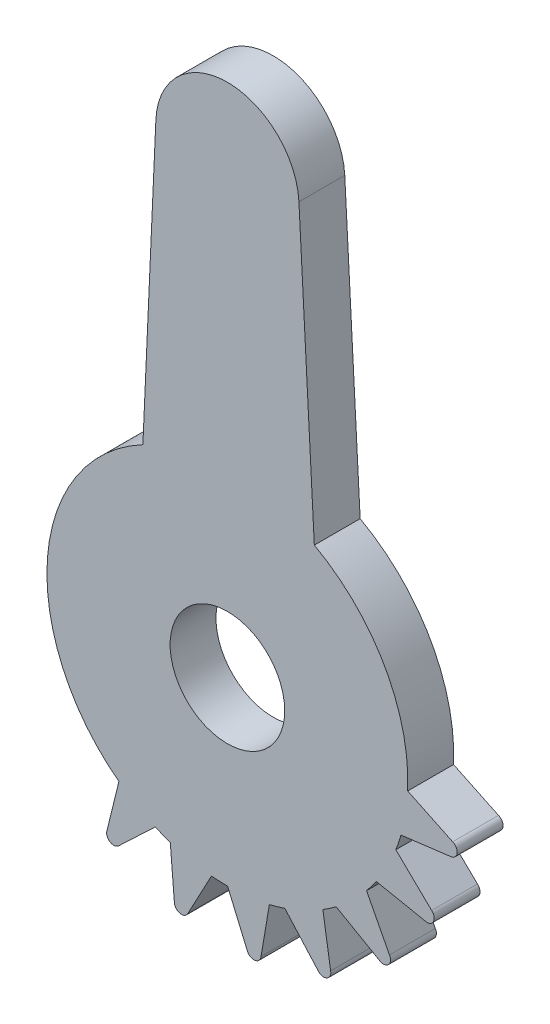
ISO-10303-21;
HEADER;
FILE_DESCRIPTION(('STEP AP214'),'2;1');
FILE_NAME('part.step','',(''),(''),'','','');
FILE_SCHEMA(('AUTOMOTIVE_DESIGN { 1 0 10303 214 1 1 1 1 }'));
ENDSEC;
DATA;
#1=APPLICATION_CONTEXT('core data for automotive mechanical design processes');
#2=APPLICATION_PROTOCOL_DEFINITION('international standard','automotive_design',2000,#1);
#3=PRODUCT_CONTEXT('',#1,'mechanical');
#4=PRODUCT('Part','Part','',(#3));
#5=PRODUCT_RELATED_PRODUCT_CATEGORY('part','',(#4));
#6=PRODUCT_DEFINITION_FORMATION('','',#4);
#7=PRODUCT_DEFINITION_CONTEXT('part definition',#1,'design');
#8=PRODUCT_DEFINITION('design','',#6,#7);
#9=PRODUCT_DEFINITION_SHAPE('','',#8);
#10=(LENGTH_UNIT() NAMED_UNIT(*) SI_UNIT(.MILLI.,.METRE.));
#11=(NAMED_UNIT(*) PLANE_ANGLE_UNIT() SI_UNIT($,.RADIAN.));
#12=(NAMED_UNIT(*) SI_UNIT($,.STERADIAN.) SOLID_ANGLE_UNIT());
#13=UNCERTAINTY_MEASURE_WITH_UNIT(LENGTH_MEASURE(1.E-05),#10,'distance_accuracy_value','');
#14=(GEOMETRIC_REPRESENTATION_CONTEXT(3) GLOBAL_UNCERTAINTY_ASSIGNED_CONTEXT((#13)) GLOBAL_UNIT_ASSIGNED_CONTEXT((#10,
#11,#12)) REPRESENTATION_CONTEXT('',''));
#15=CARTESIAN_POINT('',(0.,0.,0.));
#16=DIRECTION('',(0.,0.,1.));
#17=DIRECTION('',(1.,0.,0.));
#18=AXIS2_PLACEMENT_3D('',#15,#16,#17);
#19=CARTESIAN_POINT('',(15.,22.2824513013562,3.2));
#20=DIRECTION('',(0.,0.,-1.));
#21=DIRECTION('',(-1.,0.,0.));
#22=AXIS2_PLACEMENT_3D('',#19,#20,#21);
#23=CYLINDRICAL_SURFACE('',#22,12.6);
#24=CARTESIAN_POINT('',(15.,22.2824513013562,3.2));
#25=DIRECTION('',(0.,0.,1.));
#26=DIRECTION('',(1.,0.,0.));
#27=AXIS2_PLACEMENT_3D('',#24,#25,#26);
#28=CIRCLE('',#27,12.6);
#29=CARTESIAN_POINT('',(26.7583335934315,17.7545830274794,3.2));
#30=VERTEX_POINT('',#29);
#31=CARTESIAN_POINT('',(27.1145785737894,18.818784749928,3.2));
#32=VERTEX_POINT('',#31);
#33=EDGE_CURVE('E426',#30,#32,#28,.T.);
#34=ORIENTED_EDGE('',*,*,#33,.F.);
#35=DIRECTION('',(0.,0.,1.));
#36=VECTOR('',#35,1.);
#37=CARTESIAN_POINT('',(26.7583335934315,17.7545830274794,0.));
#38=LINE('',#37,#36);
#39=CARTESIAN_POINT('',(26.7583335934315,17.7545830274794,0.));
#40=VERTEX_POINT('',#39);
#41=EDGE_CURVE('E388',#40,#30,#38,.T.);
#42=ORIENTED_EDGE('',*,*,#41,.F.);
#43=CARTESIAN_POINT('',(15.,22.2824513013562,0.));
#44=DIRECTION('',(0.,0.,1.));
#45=DIRECTION('',(1.,0.,0.));
#46=AXIS2_PLACEMENT_3D('',#43,#44,#45);
#47=CIRCLE('',#46,12.6);
#48=CARTESIAN_POINT('',(27.1145785737894,18.818784749928,0.));
#49=VERTEX_POINT('',#48);
#50=EDGE_CURVE('E288',#40,#49,#47,.T.);
#51=ORIENTED_EDGE('',*,*,#50,.T.);
#52=DIRECTION('',(0.,0.,1.));
#53=VECTOR('',#52,1.);
#54=CARTESIAN_POINT('',(27.1145785737894,18.818784749928,0.));
#55=LINE('',#54,#53);
#56=EDGE_CURVE('E382',#49,#32,#55,.T.);
#57=ORIENTED_EDGE('',*,*,#56,.T.);
#58=EDGE_LOOP('',(#34,#42,#51,#57));
#59=FACE_BOUND('',#58,.T.);
#60=ADVANCED_FACE('F45',(#59),#23,.T.);
#61=CARTESIAN_POINT('',(24.7139922055668,14.2575927088209,0.));
#62=VERTEX_POINT('',#61);
#63=CARTESIAN_POINT('',(25.3895039093759,15.1537621850416,0.));
#64=VERTEX_POINT('',#63);
#65=EDGE_CURVE('E277',#62,#64,#47,.T.);
#66=ORIENTED_EDGE('',*,*,#65,.T.);
#67=DIRECTION('',(0.,0.,1.));
#68=VECTOR('',#67,1.);
#69=CARTESIAN_POINT('',(25.3895039093759,15.1537621850416,0.));
#70=LINE('',#69,#68);
#71=CARTESIAN_POINT('',(25.3895039093759,15.1537621850416,3.2));
#72=VERTEX_POINT('',#71);
#73=EDGE_CURVE('E257',#64,#72,#70,.T.);
#74=ORIENTED_EDGE('',*,*,#73,.T.);
#75=CARTESIAN_POINT('',(24.7139922055668,14.2575927088209,3.2));
#76=VERTEX_POINT('',#75);
#77=EDGE_CURVE('E588',#76,#72,#28,.T.);
#78=ORIENTED_EDGE('',*,*,#77,.F.);
#79=DIRECTION('',(0.,0.,1.));
#80=VECTOR('',#79,1.);
#81=CARTESIAN_POINT('',(24.7139922055668,14.2575927088209,0.));
#82=LINE('',#81,#80);
#83=EDGE_CURVE('E285',#62,#76,#82,.T.);
#84=ORIENTED_EDGE('',*,*,#83,.F.);
#85=EDGE_LOOP('',(#66,#74,#78,#84));
#86=FACE_BOUND('',#85,.T.);
#87=ADVANCED_FACE('F284',(#86),#23,.T.);
#88=CARTESIAN_POINT('',(21.6656835966238,11.5899931092611,0.));
#89=VERTEX_POINT('',#88);
#90=CARTESIAN_POINT('',(22.5906460724476,12.2255088135602,0.));
#91=VERTEX_POINT('',#90);
#92=EDGE_CURVE('E287',#89,#91,#47,.T.);
#93=ORIENTED_EDGE('',*,*,#92,.T.);
#94=DIRECTION('',(0.,0.,1.));
#95=VECTOR('',#94,1.);
#96=CARTESIAN_POINT('',(22.5906460724476,12.2255088135602,0.));
#97=LINE('',#96,#95);
#98=CARTESIAN_POINT('',(22.5906460724476,12.2255088135602,3.2));
#99=VERTEX_POINT('',#98);
#100=EDGE_CURVE('E484',#91,#99,#97,.T.);
#101=ORIENTED_EDGE('',*,*,#100,.T.);
#102=CARTESIAN_POINT('',(21.6656835966238,11.5899931092611,3.2));
#103=VERTEX_POINT('',#102);
#104=EDGE_CURVE('E592',#103,#99,#28,.T.);
#105=ORIENTED_EDGE('',*,*,#104,.F.);
#106=DIRECTION('',(0.,0.,1.));
#107=VECTOR('',#106,1.);
#108=CARTESIAN_POINT('',(21.6656835966238,11.5899931092611,0.));
#109=LINE('',#108,#107);
#110=EDGE_CURVE('E496',#89,#103,#109,.T.);
#111=ORIENTED_EDGE('',*,*,#110,.F.);
#112=EDGE_LOOP('',(#93,#101,#105,#111));
#113=FACE_BOUND('',#112,.T.);
#114=ADVANCED_FACE('F633',(#113),#23,.T.);
#115=CARTESIAN_POINT('',(17.9284586600298,10.0274878221574,0.));
#116=VERTEX_POINT('',#115);
#117=CARTESIAN_POINT('',(19.0072745482241,10.3366674972203,0.));
#118=VERTEX_POINT('',#117);
#119=EDGE_CURVE('E293',#116,#118,#47,.T.);
#120=ORIENTED_EDGE('',*,*,#119,.T.);
#121=DIRECTION('',(0.,0.,1.));
#122=VECTOR('',#121,1.);
#123=CARTESIAN_POINT('',(19.0072745482241,10.3366674972203,0.));
#124=LINE('',#123,#122);
#125=CARTESIAN_POINT('',(19.0072745482241,10.3366674972203,3.2));
#126=VERTEX_POINT('',#125);
#127=EDGE_CURVE('E459',#118,#126,#124,.T.);
#128=ORIENTED_EDGE('',*,*,#127,.T.);
#129=CARTESIAN_POINT('',(17.9284586600298,10.0274878221574,3.2));
#130=VERTEX_POINT('',#129);
#131=EDGE_CURVE('E584',#130,#126,#28,.T.);
#132=ORIENTED_EDGE('',*,*,#131,.F.);
#133=DIRECTION('',(0.,0.,1.));
#134=VECTOR('',#133,1.);
#135=CARTESIAN_POINT('',(17.9284586600298,10.0274878221574,0.));
#136=LINE('',#135,#134);
#137=EDGE_CURVE('E462',#116,#130,#136,.T.);
#138=ORIENTED_EDGE('',*,*,#137,.F.);
#139=EDGE_LOOP('',(#120,#128,#132,#138));
#140=FACE_BOUND('',#139,.T.);
#141=ADVANCED_FACE('F457',(#140),#23,.T.);
#142=CARTESIAN_POINT('',(13.8885696445755,9.73156597142661,0.));
#143=VERTEX_POINT('',#142);
#144=CARTESIAN_POINT('',(15.0097404215258,9.68245506626988,0.));
#145=VERTEX_POINT('',#144);
#146=EDGE_CURVE('E440',#143,#145,#47,.T.);
#147=ORIENTED_EDGE('',*,*,#146,.T.);
#148=DIRECTION('',(0.,0.,1.));
#149=VECTOR('',#148,1.);
#150=CARTESIAN_POINT('',(15.0097404215258,9.68245506626988,0.));
#151=LINE('',#150,#149);
#152=CARTESIAN_POINT('',(15.0097404215258,9.68245506626988,3.2));
#153=VERTEX_POINT('',#152);
#154=EDGE_CURVE('E520',#145,#153,#151,.T.);
#155=ORIENTED_EDGE('',*,*,#154,.T.);
#156=CARTESIAN_POINT('',(13.8885696445755,9.73156597142661,3.2));
#157=VERTEX_POINT('',#156);
#158=EDGE_CURVE('E581',#157,#153,#28,.T.);
#159=ORIENTED_EDGE('',*,*,#158,.F.);
#160=DIRECTION('',(0.,0.,1.));
#161=VECTOR('',#160,1.);
#162=CARTESIAN_POINT('',(13.8885696445755,9.73156597142661,0.));
#163=LINE('',#162,#161);
#164=EDGE_CURVE('E526',#143,#157,#163,.T.);
#165=ORIENTED_EDGE('',*,*,#164,.F.);
#166=EDGE_LOOP('',(#147,#155,#159,#165));
#167=FACE_BOUND('',#166,.T.);
#168=ADVANCED_FACE('F608',(#167),#23,.T.);
#169=CARTESIAN_POINT('',(9.96354994564374,10.7328118762497,0.));
#170=VERTEX_POINT('',#169);
#171=CARTESIAN_POINT('',(11.0111995960651,10.3304861350093,0.));
#172=VERTEX_POINT('',#171);
#173=EDGE_CURVE('E301',#170,#172,#47,.T.);
#174=ORIENTED_EDGE('',*,*,#173,.T.);
#175=DIRECTION('',(0.,0.,1.));
#176=VECTOR('',#175,1.);
#177=CARTESIAN_POINT('',(11.0111995960651,10.3304861350093,0.));
#178=LINE('',#177,#176);
#179=CARTESIAN_POINT('',(11.0111995960651,10.3304861350093,3.2));
#180=VERTEX_POINT('',#179);
#181=EDGE_CURVE('E344',#172,#180,#178,.T.);
#182=ORIENTED_EDGE('',*,*,#181,.T.);
#183=CARTESIAN_POINT('',(9.96354994564374,10.7328118762497,3.2));
#184=VERTEX_POINT('',#183);
#185=EDGE_CURVE('E425',#184,#180,#28,.T.);
#186=ORIENTED_EDGE('',*,*,#185,.F.);
#187=DIRECTION('',(0.,0.,1.));
#188=VECTOR('',#187,1.);
#189=CARTESIAN_POINT('',(9.96354994564374,10.7328118762497,0.));
#190=LINE('',#189,#188);
#191=EDGE_CURVE('E357',#170,#184,#190,.T.);
#192=ORIENTED_EDGE('',*,*,#191,.F.);
#193=EDGE_LOOP('',(#174,#182,#186,#192));
#194=FACE_BOUND('',#193,.T.);
#195=ADVANCED_FACE('F575',(#194),#23,.T.);
#196=CARTESIAN_POINT('',(27.5874195793468,21.7195407103414,3.2));
#197=VERTEX_POINT('',#196);
#198=CARTESIAN_POINT('',(21.0679006405689,33.3251222561652,3.2));
#199=VERTEX_POINT('',#198);
#200=EDGE_CURVE('E422',#197,#199,#28,.T.);
#201=ORIENTED_EDGE('',*,*,#200,.F.);
#202=DIRECTION('',(0.,0.,1.));
#203=VECTOR('',#202,1.);
#204=CARTESIAN_POINT('',(27.5874195793468,21.7195407103414,0.));
#205=LINE('',#204,#203);
#206=CARTESIAN_POINT('',(27.5874195793468,21.7195407103414,0.));
#207=VERTEX_POINT('',#206);
#208=EDGE_CURVE('E394',#207,#197,#205,.T.);
#209=ORIENTED_EDGE('',*,*,#208,.F.);
#210=CARTESIAN_POINT('',(21.0679006405689,33.3251222561652,0.));
#211=VERTEX_POINT('',#210);
#212=EDGE_CURVE('E294',#207,#211,#47,.T.);
#213=ORIENTED_EDGE('',*,*,#212,.T.);
#214=DIRECTION('',(0.,0.,-1.));
#215=VECTOR('',#214,1.);
#216=CARTESIAN_POINT('',(21.0679006405689,33.3251222561652,3.2));
#217=LINE('',#216,#215);
#218=EDGE_CURVE('E311',#199,#211,#217,.T.);
#219=ORIENTED_EDGE('',*,*,#218,.F.);
#220=EDGE_LOOP('',(#201,#209,#213,#219));
#221=FACE_BOUND('',#220,.T.);
#222=ADVANCED_FACE('F638',(#221),#23,.T.);
#223=CARTESIAN_POINT('',(15.0000678717785,53.2824513013562,3.2));
#224=DIRECTION('',(0.,0.,1.));
#225=DIRECTION('',(1.,0.,0.));
#226=AXIS2_PLACEMENT_3D('',#223,#224,#225);
#227=PLANE('',#226);
#228=CARTESIAN_POINT('',(15.0000678717785,53.2824513013562,3.2));
#229=DIRECTION('',(0.,0.,1.));
#230=DIRECTION('',(1.,0.,0.));
#231=AXIS2_PLACEMENT_3D('',#228,#229,#230);
#232=CIRCLE('',#231,5.);
#233=CARTESIAN_POINT('',(19.9930199252551,53.547837419463,3.2));
#234=VERTEX_POINT('',#233);
#235=CARTESIAN_POINT('',(10.0021530792262,53.4268387190461,3.2));
#236=VERTEX_POINT('',#235);
#237=EDGE_CURVE('E306',#234,#236,#232,.T.);
#238=ORIENTED_EDGE('',*,*,#237,.T.);
#239=DIRECTION('',(-0.0451163157054483,-0.998981740602483,0.));
#240=VECTOR('',#239,1.);
#241=CARTESIAN_POINT('',(9.09836644123298,33.4148688886566,3.2));
#242=LINE('',#241,#240);
#243=CARTESIAN_POINT('',(9.09836644123298,33.4148688886566,3.2));
#244=VERTEX_POINT('',#243);
#245=EDGE_CURVE('E419',#236,#244,#242,.T.);
#246=ORIENTED_EDGE('',*,*,#245,.T.);
#247=CARTESIAN_POINT('',(7.42491202057918,12.213784949548,3.2));
#248=VERTEX_POINT('',#247);
#249=EDGE_CURVE('E324',#244,#248,#28,.T.);
#250=ORIENTED_EDGE('',*,*,#249,.T.);
#251=DIRECTION('',(-0.238928061467362,-0.971037270882765,0.));
#252=VECTOR('',#251,1.);
#253=CARTESIAN_POINT('',(7.42491202057918,12.213784949548,3.2));
#254=LINE('',#253,#252);
#255=CARTESIAN_POINT('',(6.5987696482844,8.85622606915957,3.2));
#256=VERTEX_POINT('',#255);
#257=EDGE_CURVE('E350',#248,#256,#254,.T.);
#258=ORIENTED_EDGE('',*,*,#257,.T.);
#259=CARTESIAN_POINT('',(7.065559861533,8.67704209438692,3.2));
#260=DIRECTION('',(0.,0.,1.));
#261=DIRECTION('',(-0.358367949545304,-0.9335804264972,0.));
#262=AXIS2_PLACEMENT_3D('',#259,#260,#261);
#263=CIRCLE('',#262,0.5);
#264=CARTESIAN_POINT('',(7.43532642227367,8.34048200976901,3.2));
#265=VERTEX_POINT('',#264);
#266=EDGE_CURVE('E341',#256,#265,#263,.T.);
#267=ORIENTED_EDGE('',*,*,#266,.T.);
#268=DIRECTION('',(0.726358387399852,0.68731615218463,0.));
#269=VECTOR('',#268,1.);
#270=CARTESIAN_POINT('',(9.96354994564374,10.7328118762497,3.2));
#271=LINE('',#270,#269);
#272=EDGE_CURVE('E335',#265,#184,#271,.T.);
#273=ORIENTED_EDGE('',*,*,#272,.T.);
#274=ORIENTED_EDGE('',*,*,#185,.T.);
#275=DIRECTION('',(0.0815335150119343,-0.996670600514432,0.));
#276=VECTOR('',#275,1.);
#277=CARTESIAN_POINT('',(11.0111995960651,10.3304861350093,3.2));
#278=LINE('',#277,#276);
#279=CARTESIAN_POINT('',(11.2931183087513,6.88429480340664,3.2));
#280=VERTEX_POINT('',#279);
#281=EDGE_CURVE('E361',#180,#280,#278,.T.);
#282=ORIENTED_EDGE('',*,*,#281,.T.);
#283=CARTESIAN_POINT('',(11.7926424195423,6.86248510972397,3.2));
#284=DIRECTION('',(0.,0.,1.));
#285=DIRECTION('',(-0.0436193873653397,-0.999048221581858,0.));
#286=AXIS2_PLACEMENT_3D('',#283,#284,#285);
#287=CIRCLE('',#286,0.5);
#288=CARTESIAN_POINT('',(12.2500928780062,6.66064587158852,3.2));
#289=VERTEX_POINT('',#288);
#290=EDGE_CURVE('E557',#280,#289,#287,.T.);
#291=ORIENTED_EDGE('',*,*,#290,.T.);
#292=DIRECTION('',(0.470734225418094,0.882275064262856,0.));
#293=VECTOR('',#292,1.);
#294=CARTESIAN_POINT('',(13.8885696445755,9.73156597142661,3.2));
#295=LINE('',#294,#293);
#296=EDGE_CURVE('E547',#289,#157,#295,.T.);
#297=ORIENTED_EDGE('',*,*,#296,.T.);
#298=ORIENTED_EDGE('',*,*,#158,.T.);
#299=DIRECTION('',(0.393568383423217,-0.919295342950042,0.));
#300=VECTOR('',#299,1.);
#301=CARTESIAN_POINT('',(15.0097404215258,9.68245506626988,3.2));
#302=LINE('',#301,#300);
#303=CARTESIAN_POINT('',(16.3705831619918,6.50380442640759,3.2));
#304=VERTEX_POINT('',#303);
#305=EDGE_CURVE('E521',#153,#304,#302,.T.);
#306=ORIENTED_EDGE('',*,*,#305,.T.);
#307=CARTESIAN_POINT('',(16.851214009961,6.64162310431609,3.2));
#308=DIRECTION('',(0.,0.,1.));
#309=DIRECTION('',(0.275637355816996,-0.96126169593832,0.));
#310=AXIS2_PLACEMENT_3D('',#307,#308,#309);
#311=CIRCLE('',#310,0.5);
#312=CARTESIAN_POINT('',(17.3490696309129,6.59536534078871,3.2));
#313=VERTEX_POINT('',#312);
#314=EDGE_CURVE('E525',#304,#313,#311,.T.);
#315=ORIENTED_EDGE('',*,*,#314,.T.);
#316=DIRECTION('',(0.166458415158439,0.986048475493442,0.));
#317=VECTOR('',#316,1.);
#318=CARTESIAN_POINT('',(17.9284586600298,10.0274878221574,3.2));
#319=LINE('',#318,#317);
#320=EDGE_CURVE('E514',#313,#130,#319,.T.);
#321=ORIENTED_EDGE('',*,*,#320,.T.);
#322=ORIENTED_EDGE('',*,*,#131,.T.);
#323=DIRECTION('',(0.664926900871065,-0.746908439166409,0.));
#324=VECTOR('',#323,1.);
#325=CARTESIAN_POINT('',(19.0072745482241,10.3366674972203,3.2));
#326=LINE('',#325,#324);
#327=CARTESIAN_POINT('',(21.306394559137,7.75407964198749,3.2));
#328=VERTEX_POINT('',#327);
#329=EDGE_CURVE('E489',#126,#328,#326,.T.);
#330=ORIENTED_EDGE('',*,*,#329,.T.);
#331=CARTESIAN_POINT('',(21.718457653448,8.03728276044991,3.2));
#332=DIRECTION('',(0.,0.,1.));
#333=DIRECTION('',(0.566406236924831,-0.824126188622017,0.));
#334=AXIS2_PLACEMENT_3D('',#331,#332,#333);
#335=CIRCLE('',#334,0.5);
#336=CARTESIAN_POINT('',(22.2052637194363,8.15138733580546,3.2));
#337=VERTEX_POINT('',#336);
#338=EDGE_CURVE('E481',#328,#337,#335,.T.);
#339=ORIENTED_EDGE('',*,*,#338,.T.);
#340=DIRECTION('',(-0.155021320012331,0.987911124718026,0.));
#341=VECTOR('',#340,1.);
#342=CARTESIAN_POINT('',(21.6656835966238,11.5899931092611,3.2));
#343=LINE('',#342,#341);
#344=EDGE_CURVE('E475',#337,#103,#343,.T.);
#345=ORIENTED_EDGE('',*,*,#344,.T.);
#346=ORIENTED_EDGE('',*,*,#104,.T.);
#347=DIRECTION('',(0.86756343473474,-0.49732653931925,0.));
#348=VECTOR('',#347,1.);
#349=CARTESIAN_POINT('',(22.5906460724476,12.2255088135602,3.2));
#350=LINE('',#349,#348);
#351=CARTESIAN_POINT('',(25.5904231169948,10.5059011438914,3.2));
#352=VERTEX_POINT('',#351);
#353=EDGE_CURVE('E500',#99,#352,#350,.T.);
#354=ORIENTED_EDGE('',*,*,#353,.T.);
#355=CARTESIAN_POINT('',(25.8913306285708,10.9052188989151,3.2));
#356=DIRECTION('',(0.,0.,1.));
#357=DIRECTION('',(0.798635510047292,-0.601815023152049,0.));
#358=AXIS2_PLACEMENT_3D('',#355,#356,#357);
#359=CIRCLE('',#358,0.5);
#360=CARTESIAN_POINT('',(26.3167744233679,11.1678927983963,3.2));
#361=VERTEX_POINT('',#360);
#362=EDGE_CURVE('E862',#352,#361,#359,.T.);
#363=ORIENTED_EDGE('',*,*,#362,.T.);
#364=DIRECTION('',(-0.460479184816405,0.887670502129489,0.));
#365=VECTOR('',#364,1.);
#366=CARTESIAN_POINT('',(24.7139922055668,14.2575927088209,3.2));
#367=LINE('',#366,#365);
#368=EDGE_CURVE('E68',#361,#76,#367,.T.);
#369=ORIENTED_EDGE('',*,*,#368,.T.);
#370=ORIENTED_EDGE('',*,*,#77,.T.);
#371=DIRECTION('',(0.980534954230722,-0.196344604030152,0.));
#372=VECTOR('',#371,1.);
#373=CARTESIAN_POINT('',(25.3895039093759,15.1537621850416,3.2));
#374=LINE('',#373,#372);
#375=CARTESIAN_POINT('',(28.7799029618404,14.4748607786327,3.2));
#376=VERTEX_POINT('',#375);
#377=EDGE_CURVE('E262',#72,#376,#374,.T.);
#378=ORIENTED_EDGE('',*,*,#377,.T.);
#379=CARTESIAN_POINT('',(28.938555290043,14.9490226062358,3.2));
#380=DIRECTION('',(0.,0.,1.));
#381=DIRECTION('',(0.948323655206199,-0.317304656405093,0.));
#382=AXIS2_PLACEMENT_3D('',#379,#380,#381);
#383=CIRCLE('',#382,0.5);
#384=CARTESIAN_POINT('',(29.2586660531882,15.3331177758468,3.2));
#385=VERTEX_POINT('',#384);
#386=EDGE_CURVE('E829',#376,#385,#383,.T.);
#387=ORIENTED_EDGE('',*,*,#386,.T.);
#388=DIRECTION('',(-0.718345287370598,0.695686745678292,0.));
#389=VECTOR('',#388,1.);
#390=CARTESIAN_POINT('',(26.7583335934315,17.7545830274794,3.2));
#391=LINE('',#390,#389);
#392=EDGE_CURVE('E61',#385,#30,#391,.T.);
#393=ORIENTED_EDGE('',*,*,#392,.T.);
#394=ORIENTED_EDGE('',*,*,#33,.T.);
#395=DIRECTION('',(0.992165548972302,0.124930074171475,0.));
#396=VECTOR('',#395,1.);
#397=CARTESIAN_POINT('',(27.1145785737894,18.818784749928,3.2));
#398=LINE('',#397,#396);
#399=CARTESIAN_POINT('',(30.5451927733237,19.250755893096,3.2));
#400=VERTEX_POINT('',#399);
#401=EDGE_CURVE('E383',#32,#400,#398,.T.);
#402=ORIENTED_EDGE('',*,*,#401,.T.);
#403=CARTESIAN_POINT('',(30.5451927733237,19.750755893096,3.2));
#404=DIRECTION('',(0.,0.,1.));
#405=DIRECTION('',(1.,0.,0.));
#406=AXIS2_PLACEMENT_3D('',#403,#404,#405);
#407=CIRCLE('',#406,0.5);
#408=CARTESIAN_POINT('',(30.7268861964801,20.216575064,3.2));
#409=VERTEX_POINT('',#408);
#410=EDGE_CURVE('E387',#400,#409,#407,.T.);
#411=ORIENTED_EDGE('',*,*,#410,.T.);
#412=DIRECTION('',(-0.901968472422461,0.431801892950798,0.));
#413=VECTOR('',#412,1.);
#414=CARTESIAN_POINT('',(27.5874195793468,21.7195407103414,3.2));
#415=LINE('',#414,#413);
#416=EDGE_CURVE('E375',#409,#197,#415,.T.);
#417=ORIENTED_EDGE('',*,*,#416,.T.);
#418=ORIENTED_EDGE('',*,*,#200,.T.);
#419=DIRECTION('',(-0.0530772236213736,0.998590410695319,0.));
#420=VECTOR('',#419,1.);
#421=CARTESIAN_POINT('',(21.0679006405689,33.3251222561652,3.2));
#422=LINE('',#421,#420);
#423=EDGE_CURVE('E312',#199,#234,#422,.T.);
#424=ORIENTED_EDGE('',*,*,#423,.T.);
#425=EDGE_LOOP('',(#238,#246,#250,#258,#267,#273,#274,#282,#291,#297,#298,#306,#315,#321,#322,
#330,#339,#345,#346,#354,#363,#369,#370,#378,#387,#393,#394,#402,#411,#417,#418,#424));
#426=FACE_BOUND('',#425,.T.);
#427=CARTESIAN_POINT('',(15.,22.2824513013562,3.2));
#428=DIRECTION('',(0.,0.,1.));
#429=DIRECTION('',(1.,0.,0.));
#430=AXIS2_PLACEMENT_3D('',#427,#428,#429);
#431=CIRCLE('',#430,4.);
#432=CARTESIAN_POINT('',(19.,22.2824513013562,3.2));
#433=VERTEX_POINT('',#432);
#434=EDGE_CURVE('E408',#433,#433,#431,.T.);
#435=ORIENTED_EDGE('',*,*,#434,.F.);
#436=EDGE_LOOP('',(#435));
#437=FACE_BOUND('',#436,.T.);
#438=ADVANCED_FACE('F577',(#426,#437),#227,.T.);
#439=CARTESIAN_POINT('',(15.0000678717785,53.2824513013562,0.));
#440=DIRECTION('',(0.,0.,1.));
#441=DIRECTION('',(1.,0.,0.));
#442=AXIS2_PLACEMENT_3D('',#439,#440,#441);
#443=PLANE('',#442);
#444=CARTESIAN_POINT('',(15.0000678717785,53.2824513013562,0.));
#445=DIRECTION('',(0.,0.,1.));
#446=DIRECTION('',(1.,0.,0.));
#447=AXIS2_PLACEMENT_3D('',#444,#445,#446);
#448=CIRCLE('',#447,5.);
#449=CARTESIAN_POINT('',(19.9930199252551,53.547837419463,0.));
#450=VERTEX_POINT('',#449);
#451=CARTESIAN_POINT('',(10.0021530792262,53.4268387190461,0.));
#452=VERTEX_POINT('',#451);
#453=EDGE_CURVE('E412',#450,#452,#448,.T.);
#454=ORIENTED_EDGE('',*,*,#453,.F.);
#455=DIRECTION('',(-0.0530772236213736,0.998590410695319,0.));
#456=VECTOR('',#455,1.);
#457=CARTESIAN_POINT('',(21.0679006405689,33.3251222561652,0.));
#458=LINE('',#457,#456);
#459=EDGE_CURVE('E300',#211,#450,#458,.T.);
#460=ORIENTED_EDGE('',*,*,#459,.F.);
#461=ORIENTED_EDGE('',*,*,#212,.F.);
#462=DIRECTION('',(-0.901968472422461,0.431801892950798,0.));
#463=VECTOR('',#462,1.);
#464=CARTESIAN_POINT('',(27.5874195793468,21.7195407103414,0.));
#465=LINE('',#464,#463);
#466=CARTESIAN_POINT('',(30.7268861964801,20.216575064,0.));
#467=VERTEX_POINT('',#466);
#468=EDGE_CURVE('E379',#467,#207,#465,.T.);
#469=ORIENTED_EDGE('',*,*,#468,.F.);
#470=CARTESIAN_POINT('',(30.5451927733237,19.750755893096,0.));
#471=DIRECTION('',(0.,0.,1.));
#472=DIRECTION('',(1.,0.,0.));
#473=AXIS2_PLACEMENT_3D('',#470,#471,#472);
#474=CIRCLE('',#473,0.5);
#475=CARTESIAN_POINT('',(30.5451927733237,19.250755893096,0.));
#476=VERTEX_POINT('',#475);
#477=EDGE_CURVE('E374',#476,#467,#474,.T.);
#478=ORIENTED_EDGE('',*,*,#477,.F.);
#479=DIRECTION('',(0.992165548972302,0.124930074171475,0.));
#480=VECTOR('',#479,1.);
#481=CARTESIAN_POINT('',(27.1145785737894,18.818784749928,0.));
#482=LINE('',#481,#480);
#483=EDGE_CURVE('E370',#49,#476,#482,.T.);
#484=ORIENTED_EDGE('',*,*,#483,.F.);
#485=ORIENTED_EDGE('',*,*,#50,.F.);
#486=DIRECTION('',(-0.718345287370598,0.695686745678292,0.));
#487=VECTOR('',#486,1.);
#488=CARTESIAN_POINT('',(26.7583335934315,17.7545830274794,0.));
#489=LINE('',#488,#487);
#490=CARTESIAN_POINT('',(29.2586660531882,15.3331177758468,0.));
#491=VERTEX_POINT('',#490);
#492=EDGE_CURVE('E268',#491,#40,#489,.T.);
#493=ORIENTED_EDGE('',*,*,#492,.F.);
#494=CARTESIAN_POINT('',(28.938555290043,14.9490226062358,0.));
#495=DIRECTION('',(0.,0.,1.));
#496=DIRECTION('',(0.948323655206199,-0.317304656405093,0.));
#497=AXIS2_PLACEMENT_3D('',#494,#495,#496);
#498=CIRCLE('',#497,0.5);
#499=CARTESIAN_POINT('',(28.7799029618404,14.4748607786327,0.));
#500=VERTEX_POINT('',#499);
#501=EDGE_CURVE('E280',#500,#491,#498,.T.);
#502=ORIENTED_EDGE('',*,*,#501,.F.);
#503=DIRECTION('',(0.980534954230722,-0.196344604030152,0.));
#504=VECTOR('',#503,1.);
#505=CARTESIAN_POINT('',(25.3895039093759,15.1537621850416,0.));
#506=LINE('',#505,#504);
#507=EDGE_CURVE('E260',#64,#500,#506,.T.);
#508=ORIENTED_EDGE('',*,*,#507,.F.);
#509=ORIENTED_EDGE('',*,*,#65,.F.);
#510=DIRECTION('',(-0.460479184816405,0.887670502129489,0.));
#511=VECTOR('',#510,1.);
#512=CARTESIAN_POINT('',(24.7139922055668,14.2575927088209,0.));
#513=LINE('',#512,#511);
#514=CARTESIAN_POINT('',(26.3167744233679,11.1678927983963,0.));
#515=VERTEX_POINT('',#514);
#516=EDGE_CURVE('E857',#515,#62,#513,.T.);
#517=ORIENTED_EDGE('',*,*,#516,.F.);
#518=CARTESIAN_POINT('',(25.8913306285708,10.9052188989151,0.));
#519=DIRECTION('',(0.,0.,1.));
#520=DIRECTION('',(0.798635510047292,-0.601815023152049,0.));
#521=AXIS2_PLACEMENT_3D('',#518,#519,#520);
#522=CIRCLE('',#521,0.5);
#523=CARTESIAN_POINT('',(25.5904231169948,10.5059011438914,0.));
#524=VERTEX_POINT('',#523);
#525=EDGE_CURVE('E853',#524,#515,#522,.T.);
#526=ORIENTED_EDGE('',*,*,#525,.F.);
#527=DIRECTION('',(0.86756343473474,-0.49732653931925,0.));
#528=VECTOR('',#527,1.);
#529=CARTESIAN_POINT('',(22.5906460724476,12.2255088135602,0.));
#530=LINE('',#529,#528);
#531=EDGE_CURVE('E849',#91,#524,#530,.T.);
#532=ORIENTED_EDGE('',*,*,#531,.F.);
#533=ORIENTED_EDGE('',*,*,#92,.F.);
#534=DIRECTION('',(-0.155021320012331,0.987911124718026,0.));
#535=VECTOR('',#534,1.);
#536=CARTESIAN_POINT('',(21.6656835966238,11.5899931092611,0.));
#537=LINE('',#536,#535);
#538=CARTESIAN_POINT('',(22.2052637194363,8.15138733580546,0.));
#539=VERTEX_POINT('',#538);
#540=EDGE_CURVE('E479',#539,#89,#537,.T.);
#541=ORIENTED_EDGE('',*,*,#540,.F.);
#542=CARTESIAN_POINT('',(21.718457653448,8.03728276044991,0.));
#543=DIRECTION('',(0.,0.,1.));
#544=DIRECTION('',(0.566406236924831,-0.824126188622017,0.));
#545=AXIS2_PLACEMENT_3D('',#542,#543,#544);
#546=CIRCLE('',#545,0.5);
#547=CARTESIAN_POINT('',(21.306394559137,7.75407964198749,0.));
#548=VERTEX_POINT('',#547);
#549=EDGE_CURVE('E472',#548,#539,#546,.T.);
#550=ORIENTED_EDGE('',*,*,#549,.F.);
#551=DIRECTION('',(0.664926900871065,-0.746908439166409,0.));
#552=VECTOR('',#551,1.);
#553=CARTESIAN_POINT('',(19.0072745482241,10.3366674972203,0.));
#554=LINE('',#553,#552);
#555=EDGE_CURVE('E469',#118,#548,#554,.T.);
#556=ORIENTED_EDGE('',*,*,#555,.F.);
#557=ORIENTED_EDGE('',*,*,#119,.F.);
#558=DIRECTION('',(0.166458415158439,0.986048475493442,0.));
#559=VECTOR('',#558,1.);
#560=CARTESIAN_POINT('',(17.9284586600298,10.0274878221574,0.));
#561=LINE('',#560,#559);
#562=CARTESIAN_POINT('',(17.3490696309129,6.59536534078871,0.));
#563=VERTEX_POINT('',#562);
#564=EDGE_CURVE('E466',#563,#116,#561,.T.);
#565=ORIENTED_EDGE('',*,*,#564,.F.);
#566=CARTESIAN_POINT('',(16.851214009961,6.64162310431609,0.));
#567=DIRECTION('',(0.,0.,1.));
#568=DIRECTION('',(0.275637355816996,-0.96126169593832,0.));
#569=AXIS2_PLACEMENT_3D('',#566,#567,#568);
#570=CIRCLE('',#569,0.5);
#571=CARTESIAN_POINT('',(16.3705831619918,6.50380442640759,0.));
#572=VERTEX_POINT('',#571);
#573=EDGE_CURVE('E513',#572,#563,#570,.T.);
#574=ORIENTED_EDGE('',*,*,#573,.F.);
#575=DIRECTION('',(0.393568383423217,-0.919295342950042,0.));
#576=VECTOR('',#575,1.);
#577=CARTESIAN_POINT('',(15.0097404215258,9.68245506626988,0.));
#578=LINE('',#577,#576);
#579=EDGE_CURVE('E509',#145,#572,#578,.T.);
#580=ORIENTED_EDGE('',*,*,#579,.F.);
#581=ORIENTED_EDGE('',*,*,#146,.F.);
#582=DIRECTION('',(0.470734225418094,0.882275064262856,0.));
#583=VECTOR('',#582,1.);
#584=CARTESIAN_POINT('',(13.8885696445755,9.73156597142661,0.));
#585=LINE('',#584,#583);
#586=CARTESIAN_POINT('',(12.2500928780062,6.66064587158852,0.));
#587=VERTEX_POINT('',#586);
#588=EDGE_CURVE('E551',#587,#143,#585,.T.);
#589=ORIENTED_EDGE('',*,*,#588,.F.);
#590=CARTESIAN_POINT('',(11.7926424195423,6.86248510972397,0.));
#591=DIRECTION('',(0.,0.,1.));
#592=DIRECTION('',(-0.0436193873653397,-0.999048221581858,0.));
#593=AXIS2_PLACEMENT_3D('',#590,#591,#592);
#594=CIRCLE('',#593,0.5);
#595=CARTESIAN_POINT('',(11.2931183087513,6.88429480340664,0.));
#596=VERTEX_POINT('',#595);
#597=EDGE_CURVE('E546',#596,#587,#594,.T.);
#598=ORIENTED_EDGE('',*,*,#597,.F.);
#599=DIRECTION('',(0.0815335150119343,-0.996670600514432,0.));
#600=VECTOR('',#599,1.);
#601=CARTESIAN_POINT('',(11.0111995960651,10.3304861350093,0.));
#602=LINE('',#601,#600);
#603=EDGE_CURVE('E542',#172,#596,#602,.T.);
#604=ORIENTED_EDGE('',*,*,#603,.F.);
#605=ORIENTED_EDGE('',*,*,#173,.F.);
#606=DIRECTION('',(0.726358387399852,0.68731615218463,0.));
#607=VECTOR('',#606,1.);
#608=CARTESIAN_POINT('',(9.96354994564374,10.7328118762497,0.));
#609=LINE('',#608,#607);
#610=CARTESIAN_POINT('',(7.43532642227367,8.34048200976901,0.));
#611=VERTEX_POINT('',#610);
#612=EDGE_CURVE('E339',#611,#170,#609,.T.);
#613=ORIENTED_EDGE('',*,*,#612,.F.);
#614=CARTESIAN_POINT('',(7.065559861533,8.67704209438692,0.));
#615=DIRECTION('',(0.,0.,1.));
#616=DIRECTION('',(-0.358367949545304,-0.9335804264972,0.));
#617=AXIS2_PLACEMENT_3D('',#614,#615,#616);
#618=CIRCLE('',#617,0.5);
#619=CARTESIAN_POINT('',(6.5987696482844,8.85622606915957,0.));
#620=VERTEX_POINT('',#619);
#621=EDGE_CURVE('E332',#620,#611,#618,.T.);
#622=ORIENTED_EDGE('',*,*,#621,.F.);
#623=DIRECTION('',(-0.238928061467362,-0.971037270882765,0.));
#624=VECTOR('',#623,1.);
#625=CARTESIAN_POINT('',(7.42491202057918,12.213784949548,0.));
#626=LINE('',#625,#624);
#627=CARTESIAN_POINT('',(7.42491202057918,12.213784949548,0.));
#628=VERTEX_POINT('',#627);
#629=EDGE_CURVE('E329',#628,#620,#626,.T.);
#630=ORIENTED_EDGE('',*,*,#629,.F.);
#631=CARTESIAN_POINT('',(9.09836644123298,33.4148688886566,0.));
#632=VERTEX_POINT('',#631);
#633=EDGE_CURVE('E295',#632,#628,#47,.T.);
#634=ORIENTED_EDGE('',*,*,#633,.F.);
#635=DIRECTION('',(-0.0451163157054483,-0.998981740602483,0.));
#636=VECTOR('',#635,1.);
#637=CARTESIAN_POINT('',(9.09836644123298,33.4148688886566,0.));
#638=LINE('',#637,#636);
#639=EDGE_CURVE('E302',#452,#632,#638,.T.);
#640=ORIENTED_EDGE('',*,*,#639,.F.);
#641=EDGE_LOOP('',(#454,#460,#461,#469,#478,#484,#485,#493,#502,#508,#509,#517,#526,#532,#533,
#541,#550,#556,#557,#565,#574,#580,#581,#589,#598,#604,#605,#613,#622,#630,#634,#640));
#642=FACE_BOUND('',#641,.T.);
#643=CARTESIAN_POINT('',(15.,22.2824513013562,0.));
#644=DIRECTION('',(0.,0.,1.));
#645=DIRECTION('',(1.,0.,0.));
#646=AXIS2_PLACEMENT_3D('',#643,#644,#645);
#647=CIRCLE('',#646,4.);
#648=CARTESIAN_POINT('',(19.,22.2824513013562,0.));
#649=VERTEX_POINT('',#648);
#650=EDGE_CURVE('E398',#649,#649,#647,.T.);
#651=ORIENTED_EDGE('',*,*,#650,.T.);
#652=EDGE_LOOP('',(#651));
#653=FACE_BOUND('',#652,.T.);
#654=ADVANCED_FACE('F274',(#642,#653),#443,.F.);
#655=CARTESIAN_POINT('',(15.0000678717785,53.2824513013562,3.2));
#656=DIRECTION('',(0.,0.,-1.));
#657=DIRECTION('',(-1.,0.,0.));
#658=AXIS2_PLACEMENT_3D('',#655,#656,#657);
#659=CYLINDRICAL_SURFACE('',#658,5.);
#660=ORIENTED_EDGE('',*,*,#453,.T.);
#661=DIRECTION('',(0.,0.,-1.));
#662=VECTOR('',#661,1.);
#663=CARTESIAN_POINT('',(10.0021530792262,53.4268387190461,3.2));
#664=LINE('',#663,#662);
#665=EDGE_CURVE('E11',#236,#452,#664,.T.);
#666=ORIENTED_EDGE('',*,*,#665,.F.);
#667=ORIENTED_EDGE('',*,*,#237,.F.);
#668=DIRECTION('',(0.,0.,-1.));
#669=VECTOR('',#668,1.);
#670=CARTESIAN_POINT('',(19.9930199252551,53.547837419463,3.2));
#671=LINE('',#670,#669);
#672=EDGE_CURVE('E307',#234,#450,#671,.T.);
#673=ORIENTED_EDGE('',*,*,#672,.T.);
#674=EDGE_LOOP('',(#660,#666,#667,#673));
#675=FACE_BOUND('',#674,.T.);
#676=ADVANCED_FACE('F47',(#675),#659,.T.);
#677=CARTESIAN_POINT('',(9.09836644123298,33.4148688886566,3.2));
#678=DIRECTION('',(0.998981740602483,-0.0451163157054483,0.));
#679=DIRECTION('',(0.0451163157054483,0.998981740602483,0.));
#680=AXIS2_PLACEMENT_3D('',#677,#678,#679);
#681=PLANE('',#680);
#682=ORIENTED_EDGE('',*,*,#639,.T.);
#683=DIRECTION('',(0.,0.,-1.));
#684=VECTOR('',#683,1.);
#685=CARTESIAN_POINT('',(9.09836644123298,33.4148688886566,3.2));
#686=LINE('',#685,#684);
#687=EDGE_CURVE('E54',#244,#632,#686,.T.);
#688=ORIENTED_EDGE('',*,*,#687,.F.);
#689=ORIENTED_EDGE('',*,*,#245,.F.);
#690=ORIENTED_EDGE('',*,*,#665,.T.);
#691=EDGE_LOOP('',(#682,#688,#689,#690));
#692=FACE_BOUND('',#691,.T.);
#693=ADVANCED_FACE('F637',(#692),#681,.F.);
#694=ORIENTED_EDGE('',*,*,#633,.T.);
#695=DIRECTION('',(0.,0.,1.));
#696=VECTOR('',#695,1.);
#697=CARTESIAN_POINT('',(7.42491202057918,12.213784949548,0.));
#698=LINE('',#697,#696);
#699=EDGE_CURVE('E349',#628,#248,#698,.T.);
#700=ORIENTED_EDGE('',*,*,#699,.T.);
#701=ORIENTED_EDGE('',*,*,#249,.F.);
#702=ORIENTED_EDGE('',*,*,#687,.T.);
#703=EDGE_LOOP('',(#694,#700,#701,#702));
#704=FACE_BOUND('',#703,.T.);
#705=ADVANCED_FACE('F321',(#704),#23,.T.);
#706=CARTESIAN_POINT('',(21.0679006405689,33.3251222561652,3.2));
#707=DIRECTION('',(-0.998590410695319,-0.0530772236213736,0.));
#708=DIRECTION('',(0.0530772236213736,-0.99859041069532,0.));
#709=AXIS2_PLACEMENT_3D('',#706,#707,#708);
#710=PLANE('',#709);
#711=ORIENTED_EDGE('',*,*,#459,.T.);
#712=ORIENTED_EDGE('',*,*,#672,.F.);
#713=ORIENTED_EDGE('',*,*,#423,.F.);
#714=ORIENTED_EDGE('',*,*,#218,.T.);
#715=EDGE_LOOP('',(#711,#712,#713,#714));
#716=FACE_BOUND('',#715,.T.);
#717=ADVANCED_FACE('F636',(#716),#710,.F.);
#718=CARTESIAN_POINT('',(15.,22.2824513013562,3.2));
#719=DIRECTION('',(0.,0.,-1.));
#720=DIRECTION('',(-1.,0.,0.));
#721=AXIS2_PLACEMENT_3D('',#718,#719,#720);
#722=CYLINDRICAL_SURFACE('',#721,4.);
#723=ORIENTED_EDGE('',*,*,#434,.T.);
#724=EDGE_LOOP('',(#723));
#725=FACE_BOUND('',#724,.T.);
#726=ORIENTED_EDGE('',*,*,#650,.F.);
#727=EDGE_LOOP('',(#726));
#728=FACE_BOUND('',#727,.T.);
#729=ADVANCED_FACE('F644',(#725,#728),#722,.F.);
#730=CARTESIAN_POINT('',(27.5874195793468,21.7195407103414,0.));
#731=DIRECTION('',(0.431801892950798,0.901968472422461,0.));
#732=DIRECTION('',(-0.901968472422461,0.431801892950798,0.));
#733=AXIS2_PLACEMENT_3D('',#730,#731,#732);
#734=PLANE('',#733);
#735=ORIENTED_EDGE('',*,*,#416,.F.);
#736=DIRECTION('',(0.,0.,1.));
#737=VECTOR('',#736,1.);
#738=CARTESIAN_POINT('',(30.7268861964801,20.216575064,0.));
#739=LINE('',#738,#737);
#740=EDGE_CURVE('E399',#467,#409,#739,.T.);
#741=ORIENTED_EDGE('',*,*,#740,.F.);
#742=ORIENTED_EDGE('',*,*,#468,.T.);
#743=ORIENTED_EDGE('',*,*,#208,.T.);
#744=EDGE_LOOP('',(#735,#741,#742,#743));
#745=FACE_BOUND('',#744,.T.);
#746=ADVANCED_FACE('F667',(#745),#734,.T.);
#747=CARTESIAN_POINT('',(30.5451927733237,19.750755893096,0.));
#748=DIRECTION('',(0.,0.,1.));
#749=DIRECTION('',(1.,0.,0.));
#750=AXIS2_PLACEMENT_3D('',#747,#748,#749);
#751=CYLINDRICAL_SURFACE('',#750,0.5);
#752=ORIENTED_EDGE('',*,*,#410,.F.);
#753=DIRECTION('',(0.,0.,1.));
#754=VECTOR('',#753,1.);
#755=CARTESIAN_POINT('',(30.5451927733237,19.250755893096,0.));
#756=LINE('',#755,#754);
#757=EDGE_CURVE('E402',#476,#400,#756,.T.);
#758=ORIENTED_EDGE('',*,*,#757,.F.);
#759=ORIENTED_EDGE('',*,*,#477,.T.);
#760=ORIENTED_EDGE('',*,*,#740,.T.);
#761=EDGE_LOOP('',(#752,#758,#759,#760));
#762=FACE_BOUND('',#761,.T.);
#763=ADVANCED_FACE('F672',(#762),#751,.T.);
#764=CARTESIAN_POINT('',(27.1145785737894,18.818784749928,0.));
#765=DIRECTION('',(0.124930074171475,-0.992165548972302,0.));
#766=DIRECTION('',(0.992165548972302,0.124930074171475,0.));
#767=AXIS2_PLACEMENT_3D('',#764,#765,#766);
#768=PLANE('',#767);
#769=ORIENTED_EDGE('',*,*,#401,.F.);
#770=ORIENTED_EDGE('',*,*,#56,.F.);
#771=ORIENTED_EDGE('',*,*,#483,.T.);
#772=ORIENTED_EDGE('',*,*,#757,.T.);
#773=EDGE_LOOP('',(#769,#770,#771,#772));
#774=FACE_BOUND('',#773,.T.);
#775=ADVANCED_FACE('F669',(#774),#768,.T.);
#776=CARTESIAN_POINT('',(9.96354994564374,10.7328118762497,0.));
#777=DIRECTION('',(0.68731615218463,-0.726358387399852,0.));
#778=DIRECTION('',(0.726358387399852,0.687316152184631,0.));
#779=AXIS2_PLACEMENT_3D('',#776,#777,#778);
#780=PLANE('',#779);
#781=ORIENTED_EDGE('',*,*,#272,.F.);
#782=DIRECTION('',(0.,0.,1.));
#783=VECTOR('',#782,1.);
#784=CARTESIAN_POINT('',(7.43532642227367,8.34048200976901,0.));
#785=LINE('',#784,#783);
#786=EDGE_CURVE('E362',#611,#265,#785,.T.);
#787=ORIENTED_EDGE('',*,*,#786,.F.);
#788=ORIENTED_EDGE('',*,*,#612,.T.);
#789=ORIENTED_EDGE('',*,*,#191,.T.);
#790=EDGE_LOOP('',(#781,#787,#788,#789));
#791=FACE_BOUND('',#790,.T.);
#792=ADVANCED_FACE('F671',(#791),#780,.T.);
#793=CARTESIAN_POINT('',(7.065559861533,8.67704209438692,0.));
#794=DIRECTION('',(0.,0.,1.));
#795=DIRECTION('',(1.,0.,0.));
#796=AXIS2_PLACEMENT_3D('',#793,#794,#795);
#797=CYLINDRICAL_SURFACE('',#796,0.5);
#798=ORIENTED_EDGE('',*,*,#266,.F.);
#799=DIRECTION('',(0.,0.,1.));
#800=VECTOR('',#799,1.);
#801=CARTESIAN_POINT('',(6.5987696482844,8.85622606915957,0.));
#802=LINE('',#801,#800);
#803=EDGE_CURVE('E365',#620,#256,#802,.T.);
#804=ORIENTED_EDGE('',*,*,#803,.F.);
#805=ORIENTED_EDGE('',*,*,#621,.T.);
#806=ORIENTED_EDGE('',*,*,#786,.T.);
#807=EDGE_LOOP('',(#798,#804,#805,#806));
#808=FACE_BOUND('',#807,.T.);
#809=ADVANCED_FACE('F682',(#808),#797,.T.);
#810=CARTESIAN_POINT('',(7.42491202057918,12.213784949548,0.));
#811=DIRECTION('',(-0.971037270882765,0.238928061467362,0.));
#812=DIRECTION('',(-0.238928061467362,-0.971037270882765,0.));
#813=AXIS2_PLACEMENT_3D('',#810,#811,#812);
#814=PLANE('',#813);
#815=ORIENTED_EDGE('',*,*,#257,.F.);
#816=ORIENTED_EDGE('',*,*,#699,.F.);
#817=ORIENTED_EDGE('',*,*,#629,.T.);
#818=ORIENTED_EDGE('',*,*,#803,.T.);
#819=EDGE_LOOP('',(#815,#816,#817,#818));
#820=FACE_BOUND('',#819,.T.);
#821=ADVANCED_FACE('F679',(#820),#814,.T.);
#822=CARTESIAN_POINT('',(13.8885696445755,9.73156597142661,0.));
#823=DIRECTION('',(0.882275064262856,-0.470734225418094,0.));
#824=DIRECTION('',(0.470734225418094,0.882275064262856,0.));
#825=AXIS2_PLACEMENT_3D('',#822,#823,#824);
#826=PLANE('',#825);
#827=ORIENTED_EDGE('',*,*,#296,.F.);
#828=DIRECTION('',(0.,0.,1.));
#829=VECTOR('',#828,1.);
#830=CARTESIAN_POINT('',(12.2500928780062,6.66064587158852,0.));
#831=LINE('',#830,#829);
#832=EDGE_CURVE('E566',#587,#289,#831,.T.);
#833=ORIENTED_EDGE('',*,*,#832,.F.);
#834=ORIENTED_EDGE('',*,*,#588,.T.);
#835=ORIENTED_EDGE('',*,*,#164,.T.);
#836=EDGE_LOOP('',(#827,#833,#834,#835));
#837=FACE_BOUND('',#836,.T.);
#838=ADVANCED_FACE('F611',(#837),#826,.T.);
#839=CARTESIAN_POINT('',(11.7926424195423,6.86248510972397,0.));
#840=DIRECTION('',(0.,0.,1.));
#841=DIRECTION('',(1.,0.,0.));
#842=AXIS2_PLACEMENT_3D('',#839,#840,#841);
#843=CYLINDRICAL_SURFACE('',#842,0.5);
#844=ORIENTED_EDGE('',*,*,#290,.F.);
#845=DIRECTION('',(0.,0.,1.));
#846=VECTOR('',#845,1.);
#847=CARTESIAN_POINT('',(11.2931183087513,6.88429480340664,0.));
#848=LINE('',#847,#846);
#849=EDGE_CURVE('E568',#596,#280,#848,.T.);
#850=ORIENTED_EDGE('',*,*,#849,.F.);
#851=ORIENTED_EDGE('',*,*,#597,.T.);
#852=ORIENTED_EDGE('',*,*,#832,.T.);
#853=EDGE_LOOP('',(#844,#850,#851,#852));
#854=FACE_BOUND('',#853,.T.);
#855=ADVANCED_FACE('F617',(#854),#843,.T.);
#856=CARTESIAN_POINT('',(11.0111995960651,10.3304861350093,0.));
#857=DIRECTION('',(-0.996670600514432,-0.0815335150119343,0.));
#858=DIRECTION('',(0.0815335150119343,-0.996670600514432,0.));
#859=AXIS2_PLACEMENT_3D('',#856,#857,#858);
#860=PLANE('',#859);
#861=ORIENTED_EDGE('',*,*,#281,.F.);
#862=ORIENTED_EDGE('',*,*,#181,.F.);
#863=ORIENTED_EDGE('',*,*,#603,.T.);
#864=ORIENTED_EDGE('',*,*,#849,.T.);
#865=EDGE_LOOP('',(#861,#862,#863,#864));
#866=FACE_BOUND('',#865,.T.);
#867=ADVANCED_FACE('F615',(#866),#860,.T.);
#868=CARTESIAN_POINT('',(17.9284586600298,10.0274878221574,0.));
#869=DIRECTION('',(0.986048475493442,-0.166458415158439,0.));
#870=DIRECTION('',(0.166458415158439,0.986048475493442,0.));
#871=AXIS2_PLACEMENT_3D('',#868,#869,#870);
#872=PLANE('',#871);
#873=ORIENTED_EDGE('',*,*,#320,.F.);
#874=DIRECTION('',(0.,0.,1.));
#875=VECTOR('',#874,1.);
#876=CARTESIAN_POINT('',(17.3490696309129,6.59536534078871,0.));
#877=LINE('',#876,#875);
#878=EDGE_CURVE('E534',#563,#313,#877,.T.);
#879=ORIENTED_EDGE('',*,*,#878,.F.);
#880=ORIENTED_EDGE('',*,*,#564,.T.);
#881=ORIENTED_EDGE('',*,*,#137,.T.);
#882=EDGE_LOOP('',(#873,#879,#880,#881));
#883=FACE_BOUND('',#882,.T.);
#884=ADVANCED_FACE('F601',(#883),#872,.T.);
#885=CARTESIAN_POINT('',(16.851214009961,6.64162310431609,0.));
#886=DIRECTION('',(0.,0.,1.));
#887=DIRECTION('',(1.,0.,0.));
#888=AXIS2_PLACEMENT_3D('',#885,#886,#887);
#889=CYLINDRICAL_SURFACE('',#888,0.5);
#890=ORIENTED_EDGE('',*,*,#314,.F.);
#891=DIRECTION('',(0.,0.,1.));
#892=VECTOR('',#891,1.);
#893=CARTESIAN_POINT('',(16.3705831619918,6.50380442640759,0.));
#894=LINE('',#893,#892);
#895=EDGE_CURVE('E537',#572,#304,#894,.T.);
#896=ORIENTED_EDGE('',*,*,#895,.F.);
#897=ORIENTED_EDGE('',*,*,#573,.T.);
#898=ORIENTED_EDGE('',*,*,#878,.T.);
#899=EDGE_LOOP('',(#890,#896,#897,#898));
#900=FACE_BOUND('',#899,.T.);
#901=ADVANCED_FACE('F603',(#900),#889,.T.);
#902=CARTESIAN_POINT('',(15.0097404215258,9.68245506626988,0.));
#903=DIRECTION('',(-0.919295342950042,-0.393568383423217,0.));
#904=DIRECTION('',(0.393568383423217,-0.919295342950042,0.));
#905=AXIS2_PLACEMENT_3D('',#902,#903,#904);
#906=PLANE('',#905);
#907=ORIENTED_EDGE('',*,*,#305,.F.);
#908=ORIENTED_EDGE('',*,*,#154,.F.);
#909=ORIENTED_EDGE('',*,*,#579,.T.);
#910=ORIENTED_EDGE('',*,*,#895,.T.);
#911=EDGE_LOOP('',(#907,#908,#909,#910));
#912=FACE_BOUND('',#911,.T.);
#913=ADVANCED_FACE('F606',(#912),#906,.T.);
#914=CARTESIAN_POINT('',(21.6656835966238,11.5899931092611,0.));
#915=DIRECTION('',(0.987911124718026,0.155021320012331,0.));
#916=DIRECTION('',(-0.155021320012331,0.987911124718026,0.));
#917=AXIS2_PLACEMENT_3D('',#914,#915,#916);
#918=PLANE('',#917);
#919=ORIENTED_EDGE('',*,*,#344,.F.);
#920=DIRECTION('',(0.,0.,1.));
#921=VECTOR('',#920,1.);
#922=CARTESIAN_POINT('',(22.2052637194363,8.15138733580546,0.));
#923=LINE('',#922,#921);
#924=EDGE_CURVE('E501',#539,#337,#923,.T.);
#925=ORIENTED_EDGE('',*,*,#924,.F.);
#926=ORIENTED_EDGE('',*,*,#540,.T.);
#927=ORIENTED_EDGE('',*,*,#110,.T.);
#928=EDGE_LOOP('',(#919,#925,#926,#927));
#929=FACE_BOUND('',#928,.T.);
#930=ADVANCED_FACE('F739',(#929),#918,.T.);
#931=CARTESIAN_POINT('',(21.718457653448,8.03728276044991,0.));
#932=DIRECTION('',(0.,0.,1.));
#933=DIRECTION('',(1.,0.,0.));
#934=AXIS2_PLACEMENT_3D('',#931,#932,#933);
#935=CYLINDRICAL_SURFACE('',#934,0.5);
#936=ORIENTED_EDGE('',*,*,#338,.F.);
#937=DIRECTION('',(0.,0.,1.));
#938=VECTOR('',#937,1.);
#939=CARTESIAN_POINT('',(21.306394559137,7.75407964198749,0.));
#940=LINE('',#939,#938);
#941=EDGE_CURVE('E504',#548,#328,#940,.T.);
#942=ORIENTED_EDGE('',*,*,#941,.F.);
#943=ORIENTED_EDGE('',*,*,#549,.T.);
#944=ORIENTED_EDGE('',*,*,#924,.T.);
#945=EDGE_LOOP('',(#936,#942,#943,#944));
#946=FACE_BOUND('',#945,.T.);
#947=ADVANCED_FACE('F748',(#946),#935,.T.);
#948=CARTESIAN_POINT('',(19.0072745482241,10.3366674972203,0.));
#949=DIRECTION('',(-0.746908439166409,-0.664926900871065,0.));
#950=DIRECTION('',(0.664926900871065,-0.746908439166409,0.));
#951=AXIS2_PLACEMENT_3D('',#948,#949,#950);
#952=PLANE('',#951);
#953=ORIENTED_EDGE('',*,*,#329,.F.);
#954=ORIENTED_EDGE('',*,*,#127,.F.);
#955=ORIENTED_EDGE('',*,*,#555,.T.);
#956=ORIENTED_EDGE('',*,*,#941,.T.);
#957=EDGE_LOOP('',(#953,#954,#955,#956));
#958=FACE_BOUND('',#957,.T.);
#959=ADVANCED_FACE('F758',(#958),#952,.T.);
#960=CARTESIAN_POINT('',(24.7139922055668,14.2575927088209,0.));
#961=DIRECTION('',(0.887670502129489,0.460479184816406,0.));
#962=DIRECTION('',(-0.460479184816406,0.887670502129489,0.));
#963=AXIS2_PLACEMENT_3D('',#960,#961,#962);
#964=PLANE('',#963);
#965=ORIENTED_EDGE('',*,*,#368,.F.);
#966=DIRECTION('',(0.,0.,1.));
#967=VECTOR('',#966,1.);
#968=CARTESIAN_POINT('',(26.3167744233679,11.1678927983963,0.));
#969=LINE('',#968,#967);
#970=EDGE_CURVE('E836',#515,#361,#969,.T.);
#971=ORIENTED_EDGE('',*,*,#970,.F.);
#972=ORIENTED_EDGE('',*,*,#516,.T.);
#973=ORIENTED_EDGE('',*,*,#83,.T.);
#974=EDGE_LOOP('',(#965,#971,#972,#973));
#975=FACE_BOUND('',#974,.T.);
#976=ADVANCED_FACE('F768',(#975),#964,.T.);
#977=CARTESIAN_POINT('',(25.8913306285708,10.9052188989151,0.));
#978=DIRECTION('',(0.,0.,1.));
#979=DIRECTION('',(1.,0.,0.));
#980=AXIS2_PLACEMENT_3D('',#977,#978,#979);
#981=CYLINDRICAL_SURFACE('',#980,0.5);
#982=ORIENTED_EDGE('',*,*,#362,.F.);
#983=DIRECTION('',(0.,0.,1.));
#984=VECTOR('',#983,1.);
#985=CARTESIAN_POINT('',(25.5904231169948,10.5059011438914,0.));
#986=LINE('',#985,#984);
#987=EDGE_CURVE('E868',#524,#352,#986,.T.);
#988=ORIENTED_EDGE('',*,*,#987,.F.);
#989=ORIENTED_EDGE('',*,*,#525,.T.);
#990=ORIENTED_EDGE('',*,*,#970,.T.);
#991=EDGE_LOOP('',(#982,#988,#989,#990));
#992=FACE_BOUND('',#991,.T.);
#993=ADVANCED_FACE('F777',(#992),#981,.T.);
#994=CARTESIAN_POINT('',(22.5906460724476,12.2255088135602,0.));
#995=DIRECTION('',(-0.497326539319249,-0.86756343473474,0.));
#996=DIRECTION('',(0.86756343473474,-0.49732653931925,0.));
#997=AXIS2_PLACEMENT_3D('',#994,#995,#996);
#998=PLANE('',#997);
#999=ORIENTED_EDGE('',*,*,#353,.F.);
#1000=ORIENTED_EDGE('',*,*,#100,.F.);
#1001=ORIENTED_EDGE('',*,*,#531,.T.);
#1002=ORIENTED_EDGE('',*,*,#987,.T.);
#1003=EDGE_LOOP('',(#999,#1000,#1001,#1002));
#1004=FACE_BOUND('',#1003,.T.);
#1005=ADVANCED_FACE('F787',(#1004),#998,.T.);
#1006=CARTESIAN_POINT('',(26.7583335934315,17.7545830274794,0.));
#1007=DIRECTION('',(0.695686745678292,0.718345287370598,0.));
#1008=DIRECTION('',(-0.718345287370598,0.695686745678292,0.));
#1009=AXIS2_PLACEMENT_3D('',#1006,#1007,#1008);
#1010=PLANE('',#1009);
#1011=ORIENTED_EDGE('',*,*,#392,.F.);
#1012=DIRECTION('',(0.,0.,1.));
#1013=VECTOR('',#1012,1.);
#1014=CARTESIAN_POINT('',(29.2586660531882,15.3331177758468,0.));
#1015=LINE('',#1014,#1013);
#1016=EDGE_CURVE('E830',#491,#385,#1015,.T.);
#1017=ORIENTED_EDGE('',*,*,#1016,.F.);
#1018=ORIENTED_EDGE('',*,*,#492,.T.);
#1019=ORIENTED_EDGE('',*,*,#41,.T.);
#1020=EDGE_LOOP('',(#1011,#1017,#1018,#1019));
#1021=FACE_BOUND('',#1020,.T.);
#1022=ADVANCED_FACE('F797',(#1021),#1010,.T.);
#1023=CARTESIAN_POINT('',(28.938555290043,14.9490226062358,0.));
#1024=DIRECTION('',(0.,0.,1.));
#1025=DIRECTION('',(1.,0.,0.));
#1026=AXIS2_PLACEMENT_3D('',#1023,#1024,#1025);
#1027=CYLINDRICAL_SURFACE('',#1026,0.5);
#1028=ORIENTED_EDGE('',*,*,#386,.F.);
#1029=DIRECTION('',(0.,0.,1.));
#1030=VECTOR('',#1029,1.);
#1031=CARTESIAN_POINT('',(28.7799029618404,14.4748607786327,0.));
#1032=LINE('',#1031,#1030);
#1033=EDGE_CURVE('E267',#500,#376,#1032,.T.);
#1034=ORIENTED_EDGE('',*,*,#1033,.F.);
#1035=ORIENTED_EDGE('',*,*,#501,.T.);
#1036=ORIENTED_EDGE('',*,*,#1016,.T.);
#1037=EDGE_LOOP('',(#1028,#1034,#1035,#1036));
#1038=FACE_BOUND('',#1037,.T.);
#1039=ADVANCED_FACE('F807',(#1038),#1027,.T.);
#1040=CARTESIAN_POINT('',(25.3895039093759,15.1537621850416,0.));
#1041=DIRECTION('',(-0.196344604030151,-0.980534954230721,0.));
#1042=DIRECTION('',(0.980534954230721,-0.196344604030151,0.));
#1043=AXIS2_PLACEMENT_3D('',#1040,#1041,#1042);
#1044=PLANE('',#1043);
#1045=ORIENTED_EDGE('',*,*,#377,.F.);
#1046=ORIENTED_EDGE('',*,*,#73,.F.);
#1047=ORIENTED_EDGE('',*,*,#507,.T.);
#1048=ORIENTED_EDGE('',*,*,#1033,.T.);
#1049=EDGE_LOOP('',(#1045,#1046,#1047,#1048));
#1050=FACE_BOUND('',#1049,.T.);
#1051=ADVANCED_FACE('F259',(#1050),#1044,.T.);
#1052=CLOSED_SHELL('',(#60,#87,#114,#141,#168,#195,#222,#438,#654,#676,#693,#705,#717,#729,#746,
#763,#775,#792,#809,#821,#838,#855,#867,#884,#901,#913,#930,#947,#959,#976,#993,#1005,#1022,
#1039,#1051));
#1053=MANIFOLD_SOLID_BREP('B2',#1052);
#1054=ADVANCED_BREP_SHAPE_REPRESENTATION('',(#18,#1053),#14);
#1055=SHAPE_DEFINITION_REPRESENTATION(#9,#1054);
ENDSEC;
END-ISO-10303-21;
